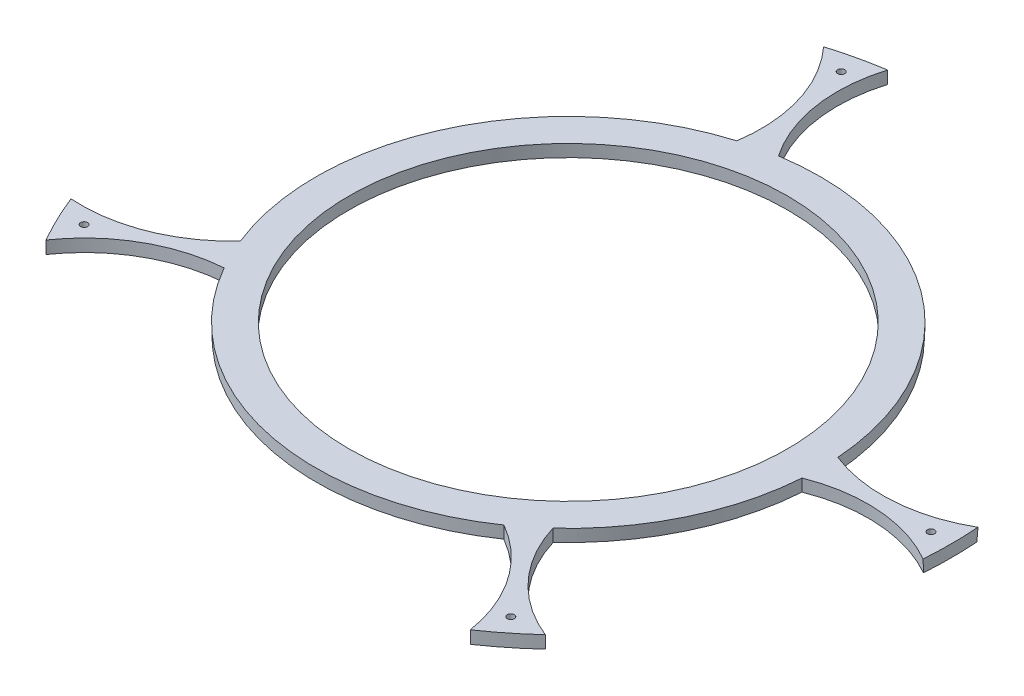
ISO-10303-21;
HEADER;
FILE_DESCRIPTION(('STEP AP214'),'2;1');
FILE_NAME('part.step','',(''),(''),'','','');
FILE_SCHEMA(('AUTOMOTIVE_DESIGN { 1 0 10303 214 1 1 1 1 }'));
ENDSEC;
DATA;
#1=APPLICATION_CONTEXT('core data for automotive mechanical design processes');
#2=APPLICATION_PROTOCOL_DEFINITION('international standard','automotive_design',2000,#1);
#3=PRODUCT_CONTEXT('',#1,'mechanical');
#4=PRODUCT('Part','Part','',(#3));
#5=PRODUCT_RELATED_PRODUCT_CATEGORY('part','',(#4));
#6=PRODUCT_DEFINITION_FORMATION('','',#4);
#7=PRODUCT_DEFINITION_CONTEXT('part definition',#1,'design');
#8=PRODUCT_DEFINITION('design','',#6,#7);
#9=PRODUCT_DEFINITION_SHAPE('','',#8);
#10=(LENGTH_UNIT() NAMED_UNIT(*) SI_UNIT(.MILLI.,.METRE.));
#11=(NAMED_UNIT(*) PLANE_ANGLE_UNIT() SI_UNIT($,.RADIAN.));
#12=(NAMED_UNIT(*) SI_UNIT($,.STERADIAN.) SOLID_ANGLE_UNIT());
#13=UNCERTAINTY_MEASURE_WITH_UNIT(LENGTH_MEASURE(1.E-05),#10,'distance_accuracy_value','');
#14=(GEOMETRIC_REPRESENTATION_CONTEXT(3) GLOBAL_UNCERTAINTY_ASSIGNED_CONTEXT((#13)) GLOBAL_UNIT_ASSIGNED_CONTEXT((#10,
#11,#12)) REPRESENTATION_CONTEXT('',''));
#15=CARTESIAN_POINT('',(0.,0.,0.));
#16=DIRECTION('',(0.,0.,1.));
#17=DIRECTION('',(1.,0.,0.));
#18=AXIS2_PLACEMENT_3D('',#15,#16,#17);
#19=CARTESIAN_POINT('',(0.,0.,0.));
#20=DIRECTION('',(0.,1.,0.));
#21=DIRECTION('',(0.,0.,1.));
#22=AXIS2_PLACEMENT_3D('',#19,#20,#21);
#23=CONICAL_SURFACE('',#22,63.5,0.0349065850398867);
#24=CARTESIAN_POINT('',(-9.84704634469965,3.191075,-62.8446522378874));
#25=CARTESIAN_POINT('',(-9.83538249234666,2.65654921550589,-62.8275860510492));
#26=CARTESIAN_POINT('',(-9.82369900814921,2.12202382325885,-62.810521041431));
#27=CARTESIAN_POINT('',(-9.80029277606541,1.05297382325886,-62.7763933766348));
#28=CARTESIAN_POINT('',(-9.78857002817905,0.518449215505895,-62.7593307214568));
#29=CARTESIAN_POINT('',(-9.77682764844824,-0.0160749999999916,-62.742269243499));
#30=B_SPLINE_CURVE_WITH_KNOTS('',3,(#24,#25,#26,#27,#28,#29),.UNSPECIFIED.,.F.,.F.,(4,2,4),(0.,
1.60477600300416,3.20955200600852),.UNSPECIFIED.);
#31=CARTESIAN_POINT('',(-9.84669556581402,3.175,-62.8441389998533));
#32=VERTEX_POINT('',#31);
#33=CARTESIAN_POINT('',(-9.77718077811927,0.,-62.7427823421306));
#34=VERTEX_POINT('',#33);
#35=EDGE_CURVE('E67',#32,#34,#30,.T.);
#36=ORIENTED_EDGE('',*,*,#35,.F.);
#37=CARTESIAN_POINT('',(0.,3.175,0.));
#38=DIRECTION('',(0.,1.,0.));
#39=DIRECTION('',(0.,0.,1.));
#40=AXIS2_PLACEMENT_3D('',#37,#38,#39);
#41=CIRCLE('',#40,63.6108734431363);
#42=CARTESIAN_POINT('',(63.4510131439968,3.175,-4.50690039817253));
#43=VERTEX_POINT('',#42);
#44=EDGE_CURVE('E167',#43,#32,#41,.T.);
#45=ORIENTED_EDGE('',*,*,#44,.F.);
#46=CARTESIAN_POINT('',(63.4510131439968,3.175,-4.50690039817253));
#47=CARTESIAN_POINT('',(63.4334045635181,2.64583343737004,-4.49399195016212));
#48=CARTESIAN_POINT('',(63.4157922772372,2.11666682272168,-4.48109069987186));
#49=CARTESIAN_POINT('',(63.3805602930712,1.05833348938835,-4.45530259473168));
#50=CARTESIAN_POINT('',(63.3629405951861,0.529166770703372,-4.44241573988174));
#51=CARTESIAN_POINT('',(63.3453171914988,0.,-4.42953608275197));
#52=B_SPLINE_CURVE_WITH_KNOTS('',3,(#46,#47,#48,#49,#50,#51),.UNSPECIFIED.,.F.,.F.,(4,2,4),(0.,
1.58885036064113,3.17770072128174),.UNSPECIFIED.);
#53=CARTESIAN_POINT('',(63.3453171914988,0.,-4.42953608275197));
#54=VERTEX_POINT('',#53);
#55=EDGE_CURVE('E287',#43,#54,#52,.T.);
#56=ORIENTED_EDGE('',*,*,#55,.T.);
#57=CARTESIAN_POINT('',(0.,0.,0.));
#58=DIRECTION('',(0.,1.,0.));
#59=DIRECTION('',(0.,0.,1.));
#60=AXIS2_PLACEMENT_3D('',#57,#58,#59);
#61=CIRCLE('',#60,63.5);
#62=EDGE_CURVE('E282',#54,#34,#61,.T.);
#63=ORIENTED_EDGE('',*,*,#62,.T.);
#64=EDGE_LOOP('',(#36,#45,#56,#63));
#65=FACE_BOUND('',#64,.T.);
#66=ADVANCED_FACE('F39',(#65),#23,.T.);
#67=CARTESIAN_POINT('',(-18.3954838543675,3.175,-60.8929338590481));
#68=VERTEX_POINT('',#67);
#69=CARTESIAN_POINT('',(-59.0774093343028,3.175,23.5839548537971));
#70=VERTEX_POINT('',#69);
#71=EDGE_CURVE('E59',#68,#70,#41,.T.);
#72=ORIENTED_EDGE('',*,*,#71,.F.);
#73=CARTESIAN_POINT('',(-18.3953904991494,3.191075,-60.8935484677932));
#74=CARTESIAN_POINT('',(-18.3984945260413,2.65654921550589,-60.8731116088867));
#75=CARTESIAN_POINT('',(-18.4016167513906,2.12202382325885,-60.8526672926807));
#76=CARTESIAN_POINT('',(-18.4078975990039,1.05297382325885,-60.81176374567));
#77=CARTESIAN_POINT('',(-18.4110562212679,0.518449215505887,-60.7913045148652));
#78=CARTESIAN_POINT('',(-18.4142330419893,-0.0160750000000003,-60.770837826761));
#79=B_SPLINE_CURVE_WITH_KNOTS('',3,(#73,#74,#75,#76,#77,#78),.UNSPECIFIED.,.F.,.F.,(4,2,4),(0.,
1.60477600300416,3.20955200600853),.UNSPECIFIED.);
#80=CARTESIAN_POINT('',(-18.4141375083022,0.,-60.7714533298764));
#81=VERTEX_POINT('',#80);
#82=EDGE_CURVE('E201',#68,#81,#79,.T.);
#83=ORIENTED_EDGE('',*,*,#82,.T.);
#84=CARTESIAN_POINT('',(-58.9940623950851,0.,23.4936289688249));
#85=VERTEX_POINT('',#84);
#86=EDGE_CURVE('E285',#81,#85,#61,.T.);
#87=ORIENTED_EDGE('',*,*,#86,.T.);
#88=CARTESIAN_POINT('',(-59.0778316487426,3.191075,23.5844110441304));
#89=CARTESIAN_POINT('',(-59.0637887981586,2.65654921550589,23.5692420450736));
#90=CARTESIAN_POINT('',(-59.0497514637756,2.12202382325885,23.5540541683397));
#91=CARTESIAN_POINT('',(-59.021687827412,1.05297382325885,23.523640659518));
#92=CARTESIAN_POINT('',(-59.0076615254312,0.518449215505887,23.5084150274302));
#93=CARTESIAN_POINT('',(-58.9936407396516,-0.0160750000000004,23.4931705176653));
#94=B_SPLINE_CURVE_WITH_KNOTS('',3,(#88,#89,#90,#91,#92,#93),.UNSPECIFIED.,.F.,.F.,(4,2,4),(0.,
1.60477600300416,3.20955200600853),.UNSPECIFIED.);
#95=EDGE_CURVE('E238',#70,#85,#94,.T.);
#96=ORIENTED_EDGE('',*,*,#95,.F.);
#97=EDGE_LOOP('',(#72,#83,#87,#96));
#98=FACE_BOUND('',#97,.T.);
#99=ADVANCED_FACE('F362',(#98),#23,.T.);
#100=CARTESIAN_POINT('',(-55.2728406259754,3.175,31.4842231813686));
#101=VERTEX_POINT('',#100);
#102=CARTESIAN_POINT('',(36.1386161673915,3.175,52.3482916789522));
#103=VERTEX_POINT('',#102);
#104=EDGE_CURVE('E373',#101,#103,#41,.T.);
#105=ORIENTED_EDGE('',*,*,#104,.F.);
#106=CARTESIAN_POINT('',(-55.2734605986864,3.191075,31.4842689300727));
#107=CARTESIAN_POINT('',(-55.252845423538,2.65654921550589,31.4827475035988));
#108=CARTESIAN_POINT('',(-55.2322189285226,2.12202382325885,31.4812421599037));
#109=CARTESIAN_POINT('',(-55.1909432987577,1.05297382325885,31.4782636380711));
#110=CARTESIAN_POINT('',(-55.1702941640082,0.518449215505887,31.4767904599336));
#111=CARTESIAN_POINT('',(-55.1496337093916,-0.0160750000000003,31.4753333645749));
#112=B_SPLINE_CURVE_WITH_KNOTS('',3,(#106,#107,#108,#109,#110,#111),.UNSPECIFIED.,.F.,.F.,(4,2,
4),(0.,1.60477600300416,3.20955200600853),.UNSPECIFIED.);
#113=CARTESIAN_POINT('',(-55.150255038804,0.,31.4753771884449));
#114=VERTEX_POINT('',#113);
#115=EDGE_CURVE('E230',#101,#114,#112,.T.);
#116=ORIENTED_EDGE('',*,*,#115,.T.);
#117=CARTESIAN_POINT('',(36.0320085021825,0.,52.2871338217983));
#118=VERTEX_POINT('',#117);
#119=EDGE_CURVE('E615',#114,#118,#61,.T.);
#120=ORIENTED_EDGE('',*,*,#119,.T.);
#121=CARTESIAN_POINT('',(36.1391548938843,3.191075,52.3486018931882));
#122=CARTESIAN_POINT('',(36.1212413850766,2.65654921550589,52.3382865460246));
#123=CARTESIAN_POINT('',(36.1033106993648,2.12202382325885,52.3279807774376));
#124=CARTESIAN_POINT('',(36.0674149741333,1.05297382325885,52.3073883974172));
#125=CARTESIAN_POINT('',(36.0494499346135,0.518449215505887,52.2971017859838));
#126=CARTESIAN_POINT('',(36.0314677181898,-0.0160749999999998,52.2868247531271));
#127=B_SPLINE_CURVE_WITH_KNOTS('',3,(#121,#122,#123,#124,#125,#126),.UNSPECIFIED.,.F.,.F.,(4,2,
4),(0.,1.60477600300416,3.20955200600853),.UNSPECIFIED.);
#128=EDGE_CURVE('E52',#103,#118,#127,.T.);
#129=ORIENTED_EDGE('',*,*,#128,.F.);
#130=EDGE_LOOP('',(#105,#116,#120,#129));
#131=FACE_BOUND('',#130,.T.);
#132=ADVANCED_FACE('F351',(#131),#23,.T.);
#133=CARTESIAN_POINT('',(0.,3.175,0.));
#134=DIRECTION('',(0.,1.,0.));
#135=DIRECTION('',(0.,0.,1.));
#136=AXIS2_PLACEMENT_3D('',#133,#134,#135);
#137=PLANE('',#136);
#138=CARTESIAN_POINT('',(-20.3473142009645,3.175,-89.1474082899061));
#139=DIRECTION('',(0.,1.,0.));
#140=DIRECTION('',(0.974927912181826,0.,-0.222520933956305));
#141=AXIS2_PLACEMENT_3D('',#138,#139,#140);
#142=CIRCLE('',#141,0.889000000000003);
#143=CARTESIAN_POINT('',(-19.4806032870349,3.175,-89.3452294001933));
#144=VERTEX_POINT('',#143);
#145=EDGE_CURVE('E575',#144,#144,#142,.T.);
#146=ORIENTED_EDGE('',*,*,#145,.F.);
#147=EDGE_LOOP('',(#146));
#148=FACE_BOUND('',#147,.T.);
#149=CARTESIAN_POINT('',(-82.3845932809974,3.175,39.674329104909));
#150=DIRECTION('',(0.,1.,0.));
#151=DIRECTION('',(-0.433883739117553,0.,-0.900968867902422));
#152=AXIS2_PLACEMENT_3D('',#149,#150,#151);
#153=CIRCLE('',#152,0.889000000000003);
#154=CARTESIAN_POINT('',(-82.7703159250729,3.175,38.8733677813438));
#155=VERTEX_POINT('',#154);
#156=EDGE_CURVE('E577',#155,#155,#153,.T.);
#157=ORIENTED_EDGE('',*,*,#156,.F.);
#158=EDGE_LOOP('',(#157));
#159=FACE_BOUND('',#158,.T.);
#160=CARTESIAN_POINT('',(57.0119074819625,3.175,71.4906707568768));
#161=DIRECTION('',(0.,1.,0.));
#162=DIRECTION('',(-0.781831482468031,0.,0.623489801858732));
#163=AXIS2_PLACEMENT_3D('',#160,#161,#162);
#164=CIRCLE('',#163,0.889000000000003);
#165=CARTESIAN_POINT('',(56.3168592940484,3.175,72.0449531907292));
#166=VERTEX_POINT('',#165);
#167=EDGE_CURVE('E187',#166,#166,#164,.T.);
#168=ORIENTED_EDGE('',*,*,#167,.F.);
#169=EDGE_LOOP('',(#168));
#170=FACE_BOUND('',#169,.T.);
#171=ORIENTED_EDGE('',*,*,#44,.T.);
#172=CARTESIAN_POINT('',(21.6082989864043,3.175,-84.3428207668807));
#173=DIRECTION('',(0.,-1.,0.));
#174=DIRECTION('',(-0.974927912181826,0.,0.222520933956305));
#175=AXIS2_PLACEMENT_3D('',#172,#173,#174);
#176=CIRCLE('',#175,38.1);
#177=CARTESIAN_POINT('',(-14.8613147827413,3.175,-95.3690291600385));
#178=VERTEX_POINT('',#177);
#179=EDGE_CURVE('E158',#32,#178,#176,.T.);
#180=ORIENTED_EDGE('',*,*,#179,.T.);
#181=CARTESIAN_POINT('',(0.,3.175,0.));
#182=DIRECTION('',(0.,-1.,0.));
#183=DIRECTION('',(-0.974927912181826,0.,0.222520933956305));
#184=AXIS2_PLACEMENT_3D('',#181,#182,#183);
#185=CIRCLE('',#184,96.52);
#186=CARTESIAN_POINT('',(-27.9894890126193,3.175,-92.3726090614121));
#187=VERTEX_POINT('',#186);
#188=EDGE_CURVE('E164',#178,#187,#185,.F.);
#189=ORIENTED_EDGE('',*,*,#188,.T.);
#190=CARTESIAN_POINT('',(-56.0633831171326,3.175,-66.614766181843));
#191=DIRECTION('',(0.,-1.,0.));
#192=DIRECTION('',(-0.974927912181826,0.,0.222520933956305));
#193=AXIS2_PLACEMENT_3D('',#190,#191,#192);
#194=CIRCLE('',#193,38.1);
#195=EDGE_CURVE('E169',#68,#187,#194,.F.);
#196=ORIENTED_EDGE('',*,*,#195,.F.);
#197=ORIENTED_EDGE('',*,*,#71,.T.);
#198=CARTESIAN_POINT('',(-87.0364690294427,3.175,-2.29849056705918));
#199=DIRECTION('',(0.,-1.,0.));
#200=DIRECTION('',(0.433883739117553,0.,0.900968867902422));
#201=AXIS2_PLACEMENT_3D('',#198,#199,#200);
#202=CIRCLE('',#201,38.1);
#203=CARTESIAN_POINT('',(-89.6709748405293,3.175,35.7103160326139));
#204=VERTEX_POINT('',#203);
#205=EDGE_CURVE('E386',#70,#204,#202,.T.);
#206=ORIENTED_EDGE('',*,*,#205,.T.);
#207=CARTESIAN_POINT('',(0.,3.175,0.));
#208=DIRECTION('',(0.,-1.,0.));
#209=DIRECTION('',(0.433883739117553,0.,0.900968867902422));
#210=AXIS2_PLACEMENT_3D('',#207,#208,#209);
#211=CIRCLE('',#210,96.52);
#212=CARTESIAN_POINT('',(-83.8283876589821,3.175,47.8425733264362));
#213=VERTEX_POINT('',#212);
#214=EDGE_CURVE('E383',#204,#213,#211,.F.);
#215=ORIENTED_EDGE('',*,*,#214,.T.);
#216=CARTESIAN_POINT('',(-52.4693185421692,3.175,69.4809370383012));
#217=DIRECTION('',(0.,-1.,0.));
#218=DIRECTION('',(0.433883739117553,0.,0.900968867902422));
#219=AXIS2_PLACEMENT_3D('',#216,#217,#218);
#220=CIRCLE('',#219,38.1);
#221=EDGE_CURVE('E378',#101,#213,#220,.F.);
#222=ORIENTED_EDGE('',*,*,#221,.F.);
#223=ORIENTED_EDGE('',*,*,#104,.T.);
#224=CARTESIAN_POINT('',(17.1265737669792,3.175,85.3657453022243));
#225=DIRECTION('',(0.,-1.,0.));
#226=DIRECTION('',(0.781831482468031,0.,-0.623489801858732));
#227=AXIS2_PLACEMENT_3D('',#224,#225,#226);
#228=CIRCLE('',#227,38.1);
#229=CARTESIAN_POINT('',(54.7686529233175,3.175,79.4764434091334));
#230=VERTEX_POINT('',#229);
#231=EDGE_CURVE('E246',#103,#230,#228,.T.);
#232=ORIENTED_EDGE('',*,*,#231,.T.);
#233=CARTESIAN_POINT('',(0.,3.175,0.));
#234=DIRECTION('',(0.,-1.,0.));
#235=DIRECTION('',(0.781831482468031,0.,-0.623489801858732));
#236=AXIS2_PLACEMENT_3D('',#233,#234,#235);
#237=CIRCLE('',#236,96.52);
#238=CARTESIAN_POINT('',(65.2966312404772,3.175,71.0806608624676));
#239=VERTEX_POINT('',#238);
#240=EDGE_CURVE('E243',#230,#239,#237,.F.);
#241=ORIENTED_EDGE('',*,*,#240,.T.);
#242=CARTESIAN_POINT('',(79.4144266492428,3.175,35.6928401779971));
#243=DIRECTION('',(0.,-1.,0.));
#244=DIRECTION('',(0.781831482468031,0.,-0.623489801858732));
#245=AXIS2_PLACEMENT_3D('',#242,#243,#244);
#246=CIRCLE('',#245,38.1);
#247=CARTESIAN_POINT('',(42.9942120913891,3.175,46.8811363646335));
#248=VERTEX_POINT('',#247);
#249=EDGE_CURVE('E249',#248,#239,#246,.F.);
#250=ORIENTED_EDGE('',*,*,#249,.F.);
#251=CARTESIAN_POINT('',(63.4510131439968,3.175,4.50690039817253));
#252=VERTEX_POINT('',#251);
#253=EDGE_CURVE('E284',#248,#252,#41,.T.);
#254=ORIENTED_EDGE('',*,*,#253,.T.);
#255=CARTESIAN_POINT('',(77.4198712861191,3.175,39.8345770661714));
#256=DIRECTION('',(0.,1.,0.));
#257=DIRECTION('',(0.,0.,1.));
#258=AXIS2_PLACEMENT_3D('',#255,#256,#257);
#259=CIRCLE('',#258,37.9891265568637);
#260=CARTESIAN_POINT('',(96.382997571437,3.175,6.91689825917626));
#261=VERTEX_POINT('',#260);
#262=EDGE_CURVE('E325',#252,#261,#259,.F.);
#263=ORIENTED_EDGE('',*,*,#262,.T.);
#264=CARTESIAN_POINT('',(0.,3.175,0.));
#265=DIRECTION('',(0.,1.,0.));
#266=DIRECTION('',(0.,0.,1.));
#267=AXIS2_PLACEMENT_3D('',#264,#265,#266);
#268=CIRCLE('',#267,96.6308734431363);
#269=CARTESIAN_POINT('',(96.382997571437,3.175,-6.91689825917626));
#270=VERTEX_POINT('',#269);
#271=EDGE_CURVE('E276',#261,#270,#268,.T.);
#272=ORIENTED_EDGE('',*,*,#271,.T.);
#273=CARTESIAN_POINT('',(77.4198712861191,3.175,-39.8345770661714));
#274=DIRECTION('',(0.,1.,0.));
#275=DIRECTION('',(0.,0.,1.));
#276=AXIS2_PLACEMENT_3D('',#273,#274,#275);
#277=CIRCLE('',#276,37.9891265568637);
#278=EDGE_CURVE('E317',#43,#270,#277,.T.);
#279=ORIENTED_EDGE('',*,*,#278,.F.);
#280=EDGE_LOOP('',(#171,#180,#189,#196,#197,#206,#215,#222,#223,#232,#241,#250,#254,#263,#272,#279));
#281=FACE_BOUND('',#280,.T.);
#282=CARTESIAN_POINT('',(91.44,3.175,0.));
#283=DIRECTION('',(0.,1.,0.));
#284=DIRECTION('',(0.,0.,1.));
#285=AXIS2_PLACEMENT_3D('',#282,#283,#284);
#286=CIRCLE('',#285,0.889000000000003);
#287=CARTESIAN_POINT('',(91.44,3.175,0.889000000000003));
#288=VERTEX_POINT('',#287);
#289=EDGE_CURVE('E260',#288,#288,#286,.T.);
#290=ORIENTED_EDGE('',*,*,#289,.F.);
#291=EDGE_LOOP('',(#290));
#292=FACE_BOUND('',#291,.T.);
#293=CARTESIAN_POINT('',(0.,3.175,0.));
#294=DIRECTION('',(0.,1.,0.));
#295=DIRECTION('',(0.,0.,1.));
#296=AXIS2_PLACEMENT_3D('',#293,#294,#295);
#297=CIRCLE('',#296,55.2611265568637);
#298=CARTESIAN_POINT('',(0.,3.175,55.2611265568637));
#299=VERTEX_POINT('',#298);
#300=EDGE_CURVE('E280',#299,#299,#297,.T.);
#301=ORIENTED_EDGE('',*,*,#300,.F.);
#302=EDGE_LOOP('',(#301));
#303=FACE_BOUND('',#302,.T.);
#304=ADVANCED_FACE('F160',(#148,#159,#170,#281,#292,#303),#137,.T.);
#305=CARTESIAN_POINT('',(0.,0.,0.));
#306=DIRECTION('',(0.,1.,0.));
#307=DIRECTION('',(0.,0.,1.));
#308=AXIS2_PLACEMENT_3D('',#305,#306,#307);
#309=PLANE('',#308);
#310=CARTESIAN_POINT('',(-20.3473142009645,0.,-89.1474082899061));
#311=DIRECTION('',(0.,1.,0.));
#312=DIRECTION('',(0.974927912181826,0.,-0.222520933956305));
#313=AXIS2_PLACEMENT_3D('',#310,#311,#312);
#314=CIRCLE('',#313,0.889000000000003);
#315=CARTESIAN_POINT('',(-19.4806032870349,0.,-89.3452294001933));
#316=VERTEX_POINT('',#315);
#317=EDGE_CURVE('E572',#316,#316,#314,.T.);
#318=ORIENTED_EDGE('',*,*,#317,.T.);
#319=EDGE_LOOP('',(#318));
#320=FACE_BOUND('',#319,.T.);
#321=CARTESIAN_POINT('',(-82.3845932809974,0.,39.674329104909));
#322=DIRECTION('',(0.,1.,0.));
#323=DIRECTION('',(-0.433883739117553,0.,-0.900968867902422));
#324=AXIS2_PLACEMENT_3D('',#321,#322,#323);
#325=CIRCLE('',#324,0.889000000000003);
#326=CARTESIAN_POINT('',(-82.7703159250729,0.,38.8733677813438));
#327=VERTEX_POINT('',#326);
#328=EDGE_CURVE('E580',#327,#327,#325,.T.);
#329=ORIENTED_EDGE('',*,*,#328,.T.);
#330=EDGE_LOOP('',(#329));
#331=FACE_BOUND('',#330,.T.);
#332=CARTESIAN_POINT('',(57.0119074819625,0.,71.4906707568768));
#333=DIRECTION('',(0.,1.,0.));
#334=DIRECTION('',(-0.781831482468031,0.,0.623489801858732));
#335=AXIS2_PLACEMENT_3D('',#332,#333,#334);
#336=CIRCLE('',#335,0.889000000000003);
#337=CARTESIAN_POINT('',(56.3168592940484,0.,72.0449531907292));
#338=VERTEX_POINT('',#337);
#339=EDGE_CURVE('E193',#338,#338,#336,.T.);
#340=ORIENTED_EDGE('',*,*,#339,.T.);
#341=EDGE_LOOP('',(#340));
#342=FACE_BOUND('',#341,.T.);
#343=CARTESIAN_POINT('',(91.44,0.,0.));
#344=DIRECTION('',(0.,1.,0.));
#345=DIRECTION('',(0.,0.,1.));
#346=AXIS2_PLACEMENT_3D('',#343,#344,#345);
#347=CIRCLE('',#346,0.889000000000003);
#348=CARTESIAN_POINT('',(91.44,0.,0.889000000000003));
#349=VERTEX_POINT('',#348);
#350=EDGE_CURVE('E263',#349,#349,#347,.T.);
#351=ORIENTED_EDGE('',*,*,#350,.T.);
#352=EDGE_LOOP('',(#351));
#353=FACE_BOUND('',#352,.T.);
#354=ORIENTED_EDGE('',*,*,#62,.F.);
#355=CARTESIAN_POINT('',(77.4198712861191,0.,-39.8345770661714));
#356=DIRECTION('',(0.,-1.,0.));
#357=DIRECTION('',(0.,0.,-1.));
#358=AXIS2_PLACEMENT_3D('',#355,#356,#357);
#359=CIRCLE('',#358,38.1);
#360=CARTESIAN_POINT('',(96.2848821310782,0.,-6.73289484578299));
#361=VERTEX_POINT('',#360);
#362=EDGE_CURVE('E273',#54,#361,#359,.F.);
#363=ORIENTED_EDGE('',*,*,#362,.T.);
#364=CARTESIAN_POINT('',(0.,0.,0.));
#365=DIRECTION('',(0.,-1.,0.));
#366=DIRECTION('',(0.,0.,-1.));
#367=AXIS2_PLACEMENT_3D('',#364,#365,#366);
#368=CIRCLE('',#367,96.52);
#369=CARTESIAN_POINT('',(96.2848821310782,0.,6.73289484578299));
#370=VERTEX_POINT('',#369);
#371=EDGE_CURVE('E266',#370,#361,#368,.F.);
#372=ORIENTED_EDGE('',*,*,#371,.F.);
#373=CARTESIAN_POINT('',(77.4198712861191,0.,39.8345770661714));
#374=DIRECTION('',(0.,-1.,0.));
#375=DIRECTION('',(0.,0.,-1.));
#376=AXIS2_PLACEMENT_3D('',#373,#374,#375);
#377=CIRCLE('',#376,38.1);
#378=CARTESIAN_POINT('',(63.3453171914988,0.,4.42953608275198));
#379=VERTEX_POINT('',#378);
#380=EDGE_CURVE('E271',#379,#370,#377,.T.);
#381=ORIENTED_EDGE('',*,*,#380,.F.);
#382=CARTESIAN_POINT('',(42.9583100266298,0.,46.7635926726761));
#383=VERTEX_POINT('',#382);
#384=EDGE_CURVE('E286',#383,#379,#61,.T.);
#385=ORIENTED_EDGE('',*,*,#384,.F.);
#386=CARTESIAN_POINT('',(79.4144266492428,0.,35.6928401779971));
#387=DIRECTION('',(0.,-1.,0.));
#388=DIRECTION('',(0.781831482468031,0.,-0.623489801858732));
#389=AXIS2_PLACEMENT_3D('',#386,#387,#388);
#390=CIRCLE('',#389,38.1);
#391=CARTESIAN_POINT('',(65.2966312404772,0.,71.0806608624676));
#392=VERTEX_POINT('',#391);
#393=EDGE_CURVE('E247',#383,#392,#390,.F.);
#394=ORIENTED_EDGE('',*,*,#393,.T.);
#395=CARTESIAN_POINT('',(0.,0.,0.));
#396=DIRECTION('',(0.,-1.,0.));
#397=DIRECTION('',(0.781831482468031,0.,-0.623489801858732));
#398=AXIS2_PLACEMENT_3D('',#395,#396,#397);
#399=CIRCLE('',#398,96.52);
#400=CARTESIAN_POINT('',(54.7686529233175,0.,79.4764434091334));
#401=VERTEX_POINT('',#400);
#402=EDGE_CURVE('E237',#401,#392,#399,.F.);
#403=ORIENTED_EDGE('',*,*,#402,.F.);
#404=CARTESIAN_POINT('',(17.1265737669792,0.,85.3657453022243));
#405=DIRECTION('',(0.,-1.,0.));
#406=DIRECTION('',(0.781831482468031,0.,-0.623489801858732));
#407=AXIS2_PLACEMENT_3D('',#404,#405,#406);
#408=CIRCLE('',#407,38.1);
#409=EDGE_CURVE('E254',#118,#401,#408,.T.);
#410=ORIENTED_EDGE('',*,*,#409,.F.);
#411=ORIENTED_EDGE('',*,*,#119,.F.);
#412=CARTESIAN_POINT('',(-52.4693185421692,0.,69.4809370383012));
#413=DIRECTION('',(0.,-1.,0.));
#414=DIRECTION('',(0.433883739117553,0.,0.900968867902422));
#415=AXIS2_PLACEMENT_3D('',#412,#413,#414);
#416=CIRCLE('',#415,38.1);
#417=CARTESIAN_POINT('',(-83.8283876589821,0.,47.8425733264362));
#418=VERTEX_POINT('',#417);
#419=EDGE_CURVE('E381',#114,#418,#416,.F.);
#420=ORIENTED_EDGE('',*,*,#419,.T.);
#421=CARTESIAN_POINT('',(0.,0.,0.));
#422=DIRECTION('',(0.,-1.,0.));
#423=DIRECTION('',(0.433883739117553,0.,0.900968867902422));
#424=AXIS2_PLACEMENT_3D('',#421,#422,#423);
#425=CIRCLE('',#424,96.52);
#426=CARTESIAN_POINT('',(-89.6709748405293,0.,35.7103160326139));
#427=VERTEX_POINT('',#426);
#428=EDGE_CURVE('E392',#427,#418,#425,.F.);
#429=ORIENTED_EDGE('',*,*,#428,.F.);
#430=CARTESIAN_POINT('',(-87.0364690294427,0.,-2.29849056705918));
#431=DIRECTION('',(0.,-1.,0.));
#432=DIRECTION('',(0.433883739117553,0.,0.900968867902422));
#433=AXIS2_PLACEMENT_3D('',#430,#431,#432);
#434=CIRCLE('',#433,38.1);
#435=EDGE_CURVE('E395',#85,#427,#434,.T.);
#436=ORIENTED_EDGE('',*,*,#435,.F.);
#437=ORIENTED_EDGE('',*,*,#86,.F.);
#438=CARTESIAN_POINT('',(-56.0633831171326,0.,-66.614766181843));
#439=DIRECTION('',(0.,-1.,0.));
#440=DIRECTION('',(-0.974927912181826,0.,0.222520933956305));
#441=AXIS2_PLACEMENT_3D('',#438,#439,#440);
#442=CIRCLE('',#441,38.1);
#443=CARTESIAN_POINT('',(-27.9894890126193,0.,-92.3726090614121));
#444=VERTEX_POINT('',#443);
#445=EDGE_CURVE('E182',#81,#444,#442,.F.);
#446=ORIENTED_EDGE('',*,*,#445,.T.);
#447=CARTESIAN_POINT('',(0.,0.,0.));
#448=DIRECTION('',(0.,-1.,0.));
#449=DIRECTION('',(-0.974927912181826,0.,0.222520933956305));
#450=AXIS2_PLACEMENT_3D('',#447,#448,#449);
#451=CIRCLE('',#450,96.52);
#452=CARTESIAN_POINT('',(-14.8613147827413,0.,-95.3690291600385));
#453=VERTEX_POINT('',#452);
#454=EDGE_CURVE('E191',#453,#444,#451,.F.);
#455=ORIENTED_EDGE('',*,*,#454,.F.);
#456=CARTESIAN_POINT('',(21.6082989864043,0.,-84.3428207668807));
#457=DIRECTION('',(0.,-1.,0.));
#458=DIRECTION('',(-0.974927912181826,0.,0.222520933956305));
#459=AXIS2_PLACEMENT_3D('',#456,#457,#458);
#460=CIRCLE('',#459,38.1);
#461=EDGE_CURVE('E175',#34,#453,#460,.T.);
#462=ORIENTED_EDGE('',*,*,#461,.F.);
#463=EDGE_LOOP('',(#354,#363,#372,#381,#385,#394,#403,#410,#411,#420,#429,#436,#437,#446,#455,#462));
#464=FACE_BOUND('',#463,.T.);
#465=CARTESIAN_POINT('',(0.,0.,0.));
#466=DIRECTION('',(0.,1.,0.));
#467=DIRECTION('',(0.,0.,1.));
#468=AXIS2_PLACEMENT_3D('',#465,#466,#467);
#469=CIRCLE('',#468,55.372);
#470=CARTESIAN_POINT('',(0.,0.,55.372));
#471=VERTEX_POINT('',#470);
#472=EDGE_CURVE('E277',#471,#471,#469,.T.);
#473=ORIENTED_EDGE('',*,*,#472,.T.);
#474=EDGE_LOOP('',(#473));
#475=FACE_BOUND('',#474,.T.);
#476=ADVANCED_FACE('F350',(#320,#331,#342,#353,#464,#475),#309,.F.);
#477=ORIENTED_EDGE('',*,*,#253,.F.);
#478=CARTESIAN_POINT('',(42.9943946499842,3.191075,46.8817306132899));
#479=CARTESIAN_POINT('',(42.9883240608209,2.65654921550589,46.8619708528631));
#480=CARTESIAN_POINT('',(42.9822666323,2.12202382325885,46.8421964776271));
#481=CARTESIAN_POINT('',(42.9701780965434,1.05297382325885,46.8026184975364));
#482=CARTESIAN_POINT('',(42.9641469893077,0.518449215505887,46.7828148926817));
#483=CARTESIAN_POINT('',(42.9581290427146,-0.0160749999999998,46.7629966730177));
#484=B_SPLINE_CURVE_WITH_KNOTS('',3,(#478,#479,#480,#481,#482,#483),.UNSPECIFIED.,.F.,.F.,(4,2,
4),(0.,1.60477600300416,3.20955200600853),.UNSPECIFIED.);
#485=EDGE_CURVE('E11',#248,#383,#484,.T.);
#486=ORIENTED_EDGE('',*,*,#485,.T.);
#487=ORIENTED_EDGE('',*,*,#384,.T.);
#488=CARTESIAN_POINT('',(63.4510131439968,3.175,4.50690039817253));
#489=CARTESIAN_POINT('',(63.4334045635181,2.64583343737004,4.49399195016212));
#490=CARTESIAN_POINT('',(63.4157922772372,2.11666682272168,4.48109069987186));
#491=CARTESIAN_POINT('',(63.3805602930712,1.05833348938835,4.45530259473168));
#492=CARTESIAN_POINT('',(63.3629405951861,0.529166770703373,4.44241573988175));
#493=CARTESIAN_POINT('',(63.3453171914988,0.,4.42953608275197));
#494=B_SPLINE_CURVE_WITH_KNOTS('',3,(#488,#489,#490,#491,#492,#493),.UNSPECIFIED.,.F.,.F.,(4,2,
4),(0.,1.58885036064113,3.17770072128174),.UNSPECIFIED.);
#495=EDGE_CURVE('E293',#252,#379,#494,.T.);
#496=ORIENTED_EDGE('',*,*,#495,.F.);
#497=EDGE_LOOP('',(#477,#486,#487,#496));
#498=FACE_BOUND('',#497,.T.);
#499=ADVANCED_FACE('F207',(#498),#23,.T.);
#500=CARTESIAN_POINT('',(0.,0.,0.));
#501=DIRECTION('',(0.,-1.,0.));
#502=DIRECTION('',(0.,0.,1.));
#503=AXIS2_PLACEMENT_3D('',#500,#501,#502);
#504=CONICAL_SURFACE('',#503,55.372,0.0349065850398867);
#505=ORIENTED_EDGE('',*,*,#300,.T.);
#506=EDGE_LOOP('',(#505));
#507=FACE_BOUND('',#506,.T.);
#508=ORIENTED_EDGE('',*,*,#472,.F.);
#509=EDGE_LOOP('',(#508));
#510=FACE_BOUND('',#509,.T.);
#511=ADVANCED_FACE('F41',(#507,#510),#504,.F.);
#512=CARTESIAN_POINT('',(0.,0.,0.));
#513=DIRECTION('',(0.,1.,0.));
#514=DIRECTION('',(0.,0.,-1.));
#515=AXIS2_PLACEMENT_3D('',#512,#513,#514);
#516=CONICAL_SURFACE('',#515,96.52,0.0349065850398867);
#517=ORIENTED_EDGE('',*,*,#371,.T.);
#518=CARTESIAN_POINT('',(96.382997571437,3.175,-6.91689825917626));
#519=CARTESIAN_POINT('',(96.3666763667549,2.64583587976127,-6.88617035802929));
#520=CARTESIAN_POINT('',(96.3503394777172,2.11667048630692,-6.85547278967293));
#521=CARTESIAN_POINT('',(96.3176343309309,1.05833715297359,-6.79413831854185));
#522=CARTESIAN_POINT('',(96.3012660731824,0.529169213094598,-6.76350141576711));
#523=CARTESIAN_POINT('',(96.2848821310782,0.,-6.732894845783));
#524=B_SPLINE_CURVE_WITH_KNOTS('',3,(#518,#519,#520,#521,#522,#523),.UNSPECIFIED.,.F.,.F.,(4,2,
4),(0.,1.59092024768214,3.18184049534453),.UNSPECIFIED.);
#525=EDGE_CURVE('E281',#270,#361,#524,.T.);
#526=ORIENTED_EDGE('',*,*,#525,.F.);
#527=ORIENTED_EDGE('',*,*,#271,.F.);
#528=CARTESIAN_POINT('',(96.382997571437,3.175,6.91689825917626));
#529=CARTESIAN_POINT('',(96.3666763667549,2.64583587976127,6.88617035802929));
#530=CARTESIAN_POINT('',(96.3503394777172,2.11667048630692,6.85547278967293));
#531=CARTESIAN_POINT('',(96.3176343309309,1.05833715297359,6.79413831854185));
#532=CARTESIAN_POINT('',(96.3012660731824,0.529169213094598,6.76350141576711));
#533=CARTESIAN_POINT('',(96.2848821310782,0.,6.732894845783));
#534=B_SPLINE_CURVE_WITH_KNOTS('',3,(#528,#529,#530,#531,#532,#533),.UNSPECIFIED.,.F.,.F.,(4,2,
4),(0.,1.59092024768214,3.18184049534453),.UNSPECIFIED.);
#535=EDGE_CURVE('E311',#261,#370,#534,.T.);
#536=ORIENTED_EDGE('',*,*,#535,.T.);
#537=EDGE_LOOP('',(#517,#526,#527,#536));
#538=FACE_BOUND('',#537,.T.);
#539=ADVANCED_FACE('F303',(#538),#516,.T.);
#540=CARTESIAN_POINT('',(77.4198712861191,0.,-39.8345770661714));
#541=DIRECTION('',(0.,-1.,0.));
#542=DIRECTION('',(0.,0.,-1.));
#543=AXIS2_PLACEMENT_3D('',#540,#541,#542);
#544=CONICAL_SURFACE('',#543,38.1,0.0349065850398867);
#545=ORIENTED_EDGE('',*,*,#362,.F.);
#546=ORIENTED_EDGE('',*,*,#55,.F.);
#547=ORIENTED_EDGE('',*,*,#278,.T.);
#548=ORIENTED_EDGE('',*,*,#525,.T.);
#549=EDGE_LOOP('',(#545,#546,#547,#548));
#550=FACE_BOUND('',#549,.T.);
#551=ADVANCED_FACE('F299',(#550),#544,.F.);
#552=CARTESIAN_POINT('',(77.4198712861191,0.,39.8345770661714));
#553=DIRECTION('',(0.,-1.,0.));
#554=DIRECTION('',(0.,0.,-1.));
#555=AXIS2_PLACEMENT_3D('',#552,#553,#554);
#556=CONICAL_SURFACE('',#555,38.1,0.0349065850398867);
#557=ORIENTED_EDGE('',*,*,#380,.T.);
#558=ORIENTED_EDGE('',*,*,#535,.F.);
#559=ORIENTED_EDGE('',*,*,#262,.F.);
#560=ORIENTED_EDGE('',*,*,#495,.T.);
#561=EDGE_LOOP('',(#557,#558,#559,#560));
#562=FACE_BOUND('',#561,.T.);
#563=ADVANCED_FACE('F302',(#562),#556,.F.);
#564=CARTESIAN_POINT('',(91.44,0.,0.));
#565=DIRECTION('',(0.,1.,0.));
#566=DIRECTION('',(0.,0.,1.));
#567=AXIS2_PLACEMENT_3D('',#564,#565,#566);
#568=CYLINDRICAL_SURFACE('',#567,0.889000000000003);
#569=ORIENTED_EDGE('',*,*,#350,.F.);
#570=EDGE_LOOP('',(#569));
#571=FACE_BOUND('',#570,.T.);
#572=ORIENTED_EDGE('',*,*,#289,.T.);
#573=EDGE_LOOP('',(#572));
#574=FACE_BOUND('',#573,.T.);
#575=ADVANCED_FACE('F345',(#571,#574),#568,.F.);
#576=CARTESIAN_POINT('',(79.4144266492428,3.175,35.6928401779971));
#577=DIRECTION('',(0.,-1.,0.));
#578=DIRECTION('',(0.,0.,-1.));
#579=AXIS2_PLACEMENT_3D('',#576,#577,#578);
#580=CYLINDRICAL_SURFACE('',#579,38.1);
#581=ORIENTED_EDGE('',*,*,#485,.F.);
#582=ORIENTED_EDGE('',*,*,#249,.T.);
#583=DIRECTION('',(0.,-1.,0.));
#584=VECTOR('',#583,1.);
#585=CARTESIAN_POINT('',(65.2966312404772,3.175,71.0806608624676));
#586=LINE('',#585,#584);
#587=EDGE_CURVE('E258',#239,#392,#586,.T.);
#588=ORIENTED_EDGE('',*,*,#587,.T.);
#589=ORIENTED_EDGE('',*,*,#393,.F.);
#590=EDGE_LOOP('',(#581,#582,#588,#589));
#591=FACE_BOUND('',#590,.T.);
#592=ADVANCED_FACE('F339',(#591),#580,.F.);
#593=CARTESIAN_POINT('',(17.1265737669792,3.175,85.3657453022243));
#594=DIRECTION('',(0.,-1.,0.));
#595=DIRECTION('',(0.,0.,-1.));
#596=AXIS2_PLACEMENT_3D('',#593,#594,#595);
#597=CYLINDRICAL_SURFACE('',#596,38.1);
#598=ORIENTED_EDGE('',*,*,#231,.F.);
#599=ORIENTED_EDGE('',*,*,#128,.T.);
#600=ORIENTED_EDGE('',*,*,#409,.T.);
#601=DIRECTION('',(0.,-1.,0.));
#602=VECTOR('',#601,1.);
#603=CARTESIAN_POINT('',(54.7686529233175,3.175,79.4764434091334));
#604=LINE('',#603,#602);
#605=EDGE_CURVE('E251',#230,#401,#604,.T.);
#606=ORIENTED_EDGE('',*,*,#605,.F.);
#607=EDGE_LOOP('',(#598,#599,#600,#606));
#608=FACE_BOUND('',#607,.T.);
#609=ADVANCED_FACE('F335',(#608),#597,.F.);
#610=CARTESIAN_POINT('',(0.,3.175,0.));
#611=DIRECTION('',(0.,-1.,0.));
#612=DIRECTION('',(0.,0.,-1.));
#613=AXIS2_PLACEMENT_3D('',#610,#611,#612);
#614=CYLINDRICAL_SURFACE('',#613,96.52);
#615=ORIENTED_EDGE('',*,*,#402,.T.);
#616=ORIENTED_EDGE('',*,*,#587,.F.);
#617=ORIENTED_EDGE('',*,*,#240,.F.);
#618=ORIENTED_EDGE('',*,*,#605,.T.);
#619=EDGE_LOOP('',(#615,#616,#617,#618));
#620=FACE_BOUND('',#619,.T.);
#621=ADVANCED_FACE('F225',(#620),#614,.T.);
#622=CARTESIAN_POINT('',(-52.4693185421692,3.175,69.4809370383012));
#623=DIRECTION('',(0.,-1.,0.));
#624=DIRECTION('',(0.,0.,-1.));
#625=AXIS2_PLACEMENT_3D('',#622,#623,#624);
#626=CYLINDRICAL_SURFACE('',#625,38.1);
#627=ORIENTED_EDGE('',*,*,#115,.F.);
#628=ORIENTED_EDGE('',*,*,#221,.T.);
#629=DIRECTION('',(0.,-1.,0.));
#630=VECTOR('',#629,1.);
#631=CARTESIAN_POINT('',(-83.8283876589821,3.175,47.8425733264362));
#632=LINE('',#631,#630);
#633=EDGE_CURVE('E389',#213,#418,#632,.T.);
#634=ORIENTED_EDGE('',*,*,#633,.T.);
#635=ORIENTED_EDGE('',*,*,#419,.F.);
#636=EDGE_LOOP('',(#627,#628,#634,#635));
#637=FACE_BOUND('',#636,.T.);
#638=ADVANCED_FACE('F220',(#637),#626,.F.);
#639=CARTESIAN_POINT('',(-87.0364690294427,3.175,-2.29849056705918));
#640=DIRECTION('',(0.,-1.,0.));
#641=DIRECTION('',(0.,0.,-1.));
#642=AXIS2_PLACEMENT_3D('',#639,#640,#641);
#643=CYLINDRICAL_SURFACE('',#642,38.1);
#644=ORIENTED_EDGE('',*,*,#205,.F.);
#645=ORIENTED_EDGE('',*,*,#95,.T.);
#646=ORIENTED_EDGE('',*,*,#435,.T.);
#647=DIRECTION('',(0.,-1.,0.));
#648=VECTOR('',#647,1.);
#649=CARTESIAN_POINT('',(-89.6709748405293,3.175,35.7103160326139));
#650=LINE('',#649,#648);
#651=EDGE_CURVE('E385',#204,#427,#650,.T.);
#652=ORIENTED_EDGE('',*,*,#651,.F.);
#653=EDGE_LOOP('',(#644,#645,#646,#652));
#654=FACE_BOUND('',#653,.T.);
#655=ADVANCED_FACE('F224',(#654),#643,.F.);
#656=CARTESIAN_POINT('',(0.,3.175,0.));
#657=DIRECTION('',(0.,-1.,0.));
#658=DIRECTION('',(0.,0.,-1.));
#659=AXIS2_PLACEMENT_3D('',#656,#657,#658);
#660=CYLINDRICAL_SURFACE('',#659,96.52);
#661=ORIENTED_EDGE('',*,*,#428,.T.);
#662=ORIENTED_EDGE('',*,*,#633,.F.);
#663=ORIENTED_EDGE('',*,*,#214,.F.);
#664=ORIENTED_EDGE('',*,*,#651,.T.);
#665=EDGE_LOOP('',(#661,#662,#663,#664));
#666=FACE_BOUND('',#665,.T.);
#667=ADVANCED_FACE('F407',(#666),#660,.T.);
#668=CARTESIAN_POINT('',(-56.0633831171326,3.175,-66.614766181843));
#669=DIRECTION('',(0.,-1.,0.));
#670=DIRECTION('',(0.,0.,-1.));
#671=AXIS2_PLACEMENT_3D('',#668,#669,#670);
#672=CYLINDRICAL_SURFACE('',#671,38.1);
#673=ORIENTED_EDGE('',*,*,#82,.F.);
#674=ORIENTED_EDGE('',*,*,#195,.T.);
#675=DIRECTION('',(0.,-1.,0.));
#676=VECTOR('',#675,1.);
#677=CARTESIAN_POINT('',(-27.9894890126193,3.175,-92.3726090614121));
#678=LINE('',#677,#676);
#679=EDGE_CURVE('E179',#187,#444,#678,.T.);
#680=ORIENTED_EDGE('',*,*,#679,.T.);
#681=ORIENTED_EDGE('',*,*,#445,.F.);
#682=EDGE_LOOP('',(#673,#674,#680,#681));
#683=FACE_BOUND('',#682,.T.);
#684=ADVANCED_FACE('F214',(#683),#672,.F.);
#685=CARTESIAN_POINT('',(21.6082989864043,3.175,-84.3428207668807));
#686=DIRECTION('',(0.,-1.,0.));
#687=DIRECTION('',(0.,0.,-1.));
#688=AXIS2_PLACEMENT_3D('',#685,#686,#687);
#689=CYLINDRICAL_SURFACE('',#688,38.1);
#690=ORIENTED_EDGE('',*,*,#179,.F.);
#691=ORIENTED_EDGE('',*,*,#35,.T.);
#692=ORIENTED_EDGE('',*,*,#461,.T.);
#693=DIRECTION('',(0.,-1.,0.));
#694=VECTOR('',#693,1.);
#695=CARTESIAN_POINT('',(-14.8613147827413,3.175,-95.3690291600385));
#696=LINE('',#695,#694);
#697=EDGE_CURVE('E172',#178,#453,#696,.T.);
#698=ORIENTED_EDGE('',*,*,#697,.F.);
#699=EDGE_LOOP('',(#690,#691,#692,#698));
#700=FACE_BOUND('',#699,.T.);
#701=ADVANCED_FACE('F173',(#700),#689,.F.);
#702=CARTESIAN_POINT('',(0.,3.175,0.));
#703=DIRECTION('',(0.,-1.,0.));
#704=DIRECTION('',(0.,0.,-1.));
#705=AXIS2_PLACEMENT_3D('',#702,#703,#704);
#706=CYLINDRICAL_SURFACE('',#705,96.52);
#707=ORIENTED_EDGE('',*,*,#454,.T.);
#708=ORIENTED_EDGE('',*,*,#679,.F.);
#709=ORIENTED_EDGE('',*,*,#188,.F.);
#710=ORIENTED_EDGE('',*,*,#697,.T.);
#711=EDGE_LOOP('',(#707,#708,#709,#710));
#712=FACE_BOUND('',#711,.T.);
#713=ADVANCED_FACE('F181',(#712),#706,.T.);
#714=CARTESIAN_POINT('',(57.0119074819625,0.,71.4906707568768));
#715=DIRECTION('',(0.,1.,0.));
#716=DIRECTION('',(0.,0.,1.));
#717=AXIS2_PLACEMENT_3D('',#714,#715,#716);
#718=CYLINDRICAL_SURFACE('',#717,0.889000000000003);
#719=ORIENTED_EDGE('',*,*,#339,.F.);
#720=EDGE_LOOP('',(#719));
#721=FACE_BOUND('',#720,.T.);
#722=ORIENTED_EDGE('',*,*,#167,.T.);
#723=EDGE_LOOP('',(#722));
#724=FACE_BOUND('',#723,.T.);
#725=ADVANCED_FACE('F219',(#721,#724),#718,.F.);
#726=CARTESIAN_POINT('',(-82.3845932809974,0.,39.674329104909));
#727=DIRECTION('',(0.,1.,0.));
#728=DIRECTION('',(0.,0.,1.));
#729=AXIS2_PLACEMENT_3D('',#726,#727,#728);
#730=CYLINDRICAL_SURFACE('',#729,0.889000000000003);
#731=ORIENTED_EDGE('',*,*,#328,.F.);
#732=EDGE_LOOP('',(#731));
#733=FACE_BOUND('',#732,.T.);
#734=ORIENTED_EDGE('',*,*,#156,.T.);
#735=EDGE_LOOP('',(#734));
#736=FACE_BOUND('',#735,.T.);
#737=ADVANCED_FACE('F545',(#733,#736),#730,.F.);
#738=CARTESIAN_POINT('',(-20.3473142009645,0.,-89.1474082899061));
#739=DIRECTION('',(0.,1.,0.));
#740=DIRECTION('',(0.,0.,1.));
#741=AXIS2_PLACEMENT_3D('',#738,#739,#740);
#742=CYLINDRICAL_SURFACE('',#741,0.889000000000003);
#743=ORIENTED_EDGE('',*,*,#317,.F.);
#744=EDGE_LOOP('',(#743));
#745=FACE_BOUND('',#744,.T.);
#746=ORIENTED_EDGE('',*,*,#145,.T.);
#747=EDGE_LOOP('',(#746));
#748=FACE_BOUND('',#747,.T.);
#749=ADVANCED_FACE('F553',(#745,#748),#742,.F.);
#750=CLOSED_SHELL('',(#66,#99,#132,#304,#476,#499,#511,#539,#551,#563,#575,#592,#609,#621,#638,
#655,#667,#684,#701,#713,#725,#737,#749));
#751=MANIFOLD_SOLID_BREP('B2',#750);
#752=ADVANCED_BREP_SHAPE_REPRESENTATION('',(#18,#751),#14);
#753=SHAPE_DEFINITION_REPRESENTATION(#9,#752);
ENDSEC;
END-ISO-10303-21;
